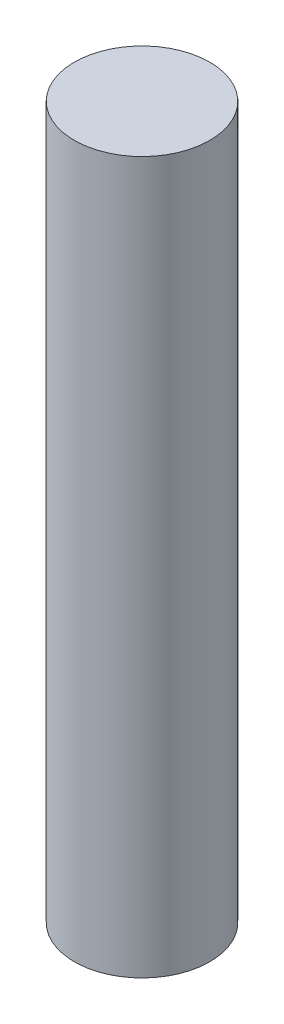
ISO-10303-21;
HEADER;
FILE_DESCRIPTION(('STEP AP214'),'2;1');
FILE_NAME('part.step','',(''),(''),'','','');
FILE_SCHEMA(('AUTOMOTIVE_DESIGN { 1 0 10303 214 1 1 1 1 }'));
ENDSEC;
DATA;
#1=APPLICATION_CONTEXT('core data for automotive mechanical design processes');
#2=APPLICATION_PROTOCOL_DEFINITION('international standard','automotive_design',2000,#1);
#3=PRODUCT_CONTEXT('',#1,'mechanical');
#4=PRODUCT('Part','Part','',(#3));
#5=PRODUCT_RELATED_PRODUCT_CATEGORY('part','',(#4));
#6=PRODUCT_DEFINITION_FORMATION('','',#4);
#7=PRODUCT_DEFINITION_CONTEXT('part definition',#1,'design');
#8=PRODUCT_DEFINITION('design','',#6,#7);
#9=PRODUCT_DEFINITION_SHAPE('','',#8);
#10=(LENGTH_UNIT() NAMED_UNIT(*) SI_UNIT(.MILLI.,.METRE.));
#11=(NAMED_UNIT(*) PLANE_ANGLE_UNIT() SI_UNIT($,.RADIAN.));
#12=(NAMED_UNIT(*) SI_UNIT($,.STERADIAN.) SOLID_ANGLE_UNIT());
#13=UNCERTAINTY_MEASURE_WITH_UNIT(LENGTH_MEASURE(1.E-05),#10,'distance_accuracy_value','');
#14=(GEOMETRIC_REPRESENTATION_CONTEXT(3) GLOBAL_UNCERTAINTY_ASSIGNED_CONTEXT((#13)) GLOBAL_UNIT_ASSIGNED_CONTEXT((#10,
#11,#12)) REPRESENTATION_CONTEXT('',''));
#15=CARTESIAN_POINT('',(0.,0.,0.));
#16=DIRECTION('',(0.,0.,1.));
#17=DIRECTION('',(1.,0.,0.));
#18=AXIS2_PLACEMENT_3D('',#15,#16,#17);
#19=CARTESIAN_POINT('',(0.,10.5,0.));
#20=DIRECTION('',(0.,-1.,0.));
#21=DIRECTION('',(0.,0.,-1.));
#22=AXIS2_PLACEMENT_3D('',#19,#20,#21);
#23=CYLINDRICAL_SURFACE('',#22,1.);
#24=CARTESIAN_POINT('',(0.,10.5,0.));
#25=DIRECTION('',(0.,1.,0.));
#26=DIRECTION('',(0.,0.,1.));
#27=AXIS2_PLACEMENT_3D('',#24,#25,#26);
#28=CIRCLE('',#27,1.);
#29=CARTESIAN_POINT('',(0.,10.5,-1.));
#30=VERTEX_POINT('',#29);
#31=EDGE_CURVE('E10',#30,#30,#28,.T.);
#32=CARTESIAN_POINT('',(0.,0.,0.));
#33=DIRECTION('',(0.,1.,0.));
#34=DIRECTION('',(0.,0.,1.));
#35=AXIS2_PLACEMENT_3D('',#32,#33,#34);
#36=CIRCLE('',#35,1.);
#37=CARTESIAN_POINT('',(0.,0.,-1.));
#38=VERTEX_POINT('',#37);
#39=EDGE_CURVE('E33',#38,#38,#36,.T.);
#40=CARTESIAN_POINT('',(0.,10.5,-1.));
#41=CARTESIAN_POINT('',(0.,10.390625,-1.));
#42=CARTESIAN_POINT('',(0.,10.28125,-1.));
#43=CARTESIAN_POINT('',(0.,10.0625,-1.));
#44=CARTESIAN_POINT('',(0.,9.953125,-1.));
#45=CARTESIAN_POINT('',(0.,9.734375,-1.));
#46=CARTESIAN_POINT('',(0.,9.625,-1.));
#47=CARTESIAN_POINT('',(0.,9.40625,-1.));
#48=CARTESIAN_POINT('',(0.,9.296875,-1.));
#49=CARTESIAN_POINT('',(0.,9.078125,-1.));
#50=CARTESIAN_POINT('',(0.,8.96875,-1.));
#51=CARTESIAN_POINT('',(0.,8.75,-1.));
#52=CARTESIAN_POINT('',(0.,8.640625,-1.));
#53=CARTESIAN_POINT('',(0.,8.421875,-1.));
#54=CARTESIAN_POINT('',(0.,8.3125,-1.));
#55=CARTESIAN_POINT('',(0.,8.09375,-1.));
#56=CARTESIAN_POINT('',(0.,7.984375,-1.));
#57=CARTESIAN_POINT('',(0.,7.765625,-1.));
#58=CARTESIAN_POINT('',(0.,7.65625,-1.));
#59=CARTESIAN_POINT('',(0.,7.4375,-1.));
#60=CARTESIAN_POINT('',(0.,7.328125,-1.));
#61=CARTESIAN_POINT('',(0.,7.109375,-1.));
#62=CARTESIAN_POINT('',(0.,7.,-1.));
#63=CARTESIAN_POINT('',(0.,6.78125,-1.));
#64=CARTESIAN_POINT('',(0.,6.671875,-1.));
#65=CARTESIAN_POINT('',(0.,6.453125,-1.));
#66=CARTESIAN_POINT('',(0.,6.34375,-1.));
#67=CARTESIAN_POINT('',(0.,6.125,-1.));
#68=CARTESIAN_POINT('',(0.,6.015625,-1.));
#69=CARTESIAN_POINT('',(0.,5.796875,-1.));
#70=CARTESIAN_POINT('',(0.,5.6875,-1.));
#71=CARTESIAN_POINT('',(0.,5.46875,-1.));
#72=CARTESIAN_POINT('',(0.,5.359375,-1.));
#73=CARTESIAN_POINT('',(0.,5.140625,-1.));
#74=CARTESIAN_POINT('',(0.,5.03125,-1.));
#75=CARTESIAN_POINT('',(0.,4.8125,-1.));
#76=CARTESIAN_POINT('',(0.,4.703125,-1.));
#77=CARTESIAN_POINT('',(0.,4.484375,-1.));
#78=CARTESIAN_POINT('',(0.,4.375,-1.));
#79=CARTESIAN_POINT('',(0.,4.15625,-1.));
#80=CARTESIAN_POINT('',(0.,4.046875,-1.));
#81=CARTESIAN_POINT('',(0.,3.828125,-1.));
#82=CARTESIAN_POINT('',(0.,3.71875,-1.));
#83=CARTESIAN_POINT('',(0.,3.5,-1.));
#84=CARTESIAN_POINT('',(0.,3.390625,-1.));
#85=CARTESIAN_POINT('',(0.,3.171875,-1.));
#86=CARTESIAN_POINT('',(0.,3.0625,-1.));
#87=CARTESIAN_POINT('',(0.,2.84375,-1.));
#88=CARTESIAN_POINT('',(0.,2.734375,-1.));
#89=CARTESIAN_POINT('',(0.,2.515625,-1.));
#90=CARTESIAN_POINT('',(0.,2.40625,-1.));
#91=CARTESIAN_POINT('',(0.,2.1875,-1.));
#92=CARTESIAN_POINT('',(0.,2.078125,-1.));
#93=CARTESIAN_POINT('',(0.,1.859375,-1.));
#94=CARTESIAN_POINT('',(0.,1.75,-1.));
#95=CARTESIAN_POINT('',(0.,1.53125,-1.));
#96=CARTESIAN_POINT('',(0.,1.421875,-1.));
#97=CARTESIAN_POINT('',(0.,1.203125,-1.));
#98=CARTESIAN_POINT('',(0.,1.09375,-1.));
#99=CARTESIAN_POINT('',(0.,0.875000000000001,-1.));
#100=CARTESIAN_POINT('',(0.,0.765625000000001,-1.));
#101=CARTESIAN_POINT('',(0.,0.546875,-1.));
#102=CARTESIAN_POINT('',(0.,0.4375,-1.));
#103=CARTESIAN_POINT('',(0.,0.21875,-1.));
#104=CARTESIAN_POINT('',(0.,0.109375,-1.));
#105=CARTESIAN_POINT('',(0.,0.,-1.));
#106=B_SPLINE_CURVE_WITH_KNOTS('',3,(#40,#41,#42,#43,#44,#45,#46,#47,#48,#49,#50,#51,#52,#53,
#54,#55,#56,#57,#58,#59,#60,#61,#62,#63,#64,#65,#66,#67,#68,#69,#70,#71,#72,#73,#74,#75,#76,#77,
#78,#79,#80,#81,#82,#83,#84,#85,#86,#87,#88,#89,#90,#91,#92,#93,#94,#95,#96,#97,#98,#99,#100,
#101,#102,#103,#104,#105),.UNSPECIFIED.,.F.,.F.,(4,2,2,2,2,2,2,2,2,2,2,2,2,2,2,2,2,2,2,2,2,2,2,
2,2,2,2,2,2,2,2,2,4),(0.,0.328125,0.656250000000001,0.984375000000001,1.3125,1.640625,1.96875,
2.296875,2.625,2.953125,3.28125,3.609375,3.9375,4.265625,4.59375,4.921875,5.25,5.578125,5.90625,
6.234375,6.5625,6.890625,7.21875,7.546875,7.875,8.203125,8.53125,8.859375,9.1875,9.515625,
9.84375,10.171875,10.5),.UNSPECIFIED.);
#107=EDGE_CURVE('BSEAM30',#30,#38,#106,.T.);
#108=ORIENTED_EDGE('',*,*,#31,.F.);
#109=ORIENTED_EDGE('',*,*,#39,.T.);
#110=ORIENTED_EDGE('',*,*,#107,.T.);
#111=ORIENTED_EDGE('',*,*,#107,.F.);
#112=EDGE_LOOP('',(#108,#110,#109,#111));
#113=FACE_BOUND('',#112,.T.);
#114=ADVANCED_FACE('F30',(#113),#23,.T.);
#115=CARTESIAN_POINT('',(0.,10.5,0.));
#116=DIRECTION('',(0.,1.,0.));
#117=DIRECTION('',(0.,0.,1.));
#118=AXIS2_PLACEMENT_3D('',#115,#116,#117);
#119=PLANE('',#118);
#120=ORIENTED_EDGE('',*,*,#31,.T.);
#121=EDGE_LOOP('',(#120));
#122=FACE_BOUND('',#121,.T.);
#123=ADVANCED_FACE('F45',(#122),#119,.T.);
#124=CARTESIAN_POINT('',(0.,0.,0.));
#125=DIRECTION('',(0.,1.,0.));
#126=DIRECTION('',(0.,0.,1.));
#127=AXIS2_PLACEMENT_3D('',#124,#125,#126);
#128=PLANE('',#127);
#129=ORIENTED_EDGE('',*,*,#39,.F.);
#130=EDGE_LOOP('',(#129));
#131=FACE_BOUND('',#130,.T.);
#132=ADVANCED_FACE('F43',(#131),#128,.F.);
#133=CLOSED_SHELL('',(#114,#123,#132));
#134=MANIFOLD_SOLID_BREP('B2',#133);
#135=ADVANCED_BREP_SHAPE_REPRESENTATION('',(#18,#134),#14);
#136=SHAPE_DEFINITION_REPRESENTATION(#9,#135);
ENDSEC;
END-ISO-10303-21;
